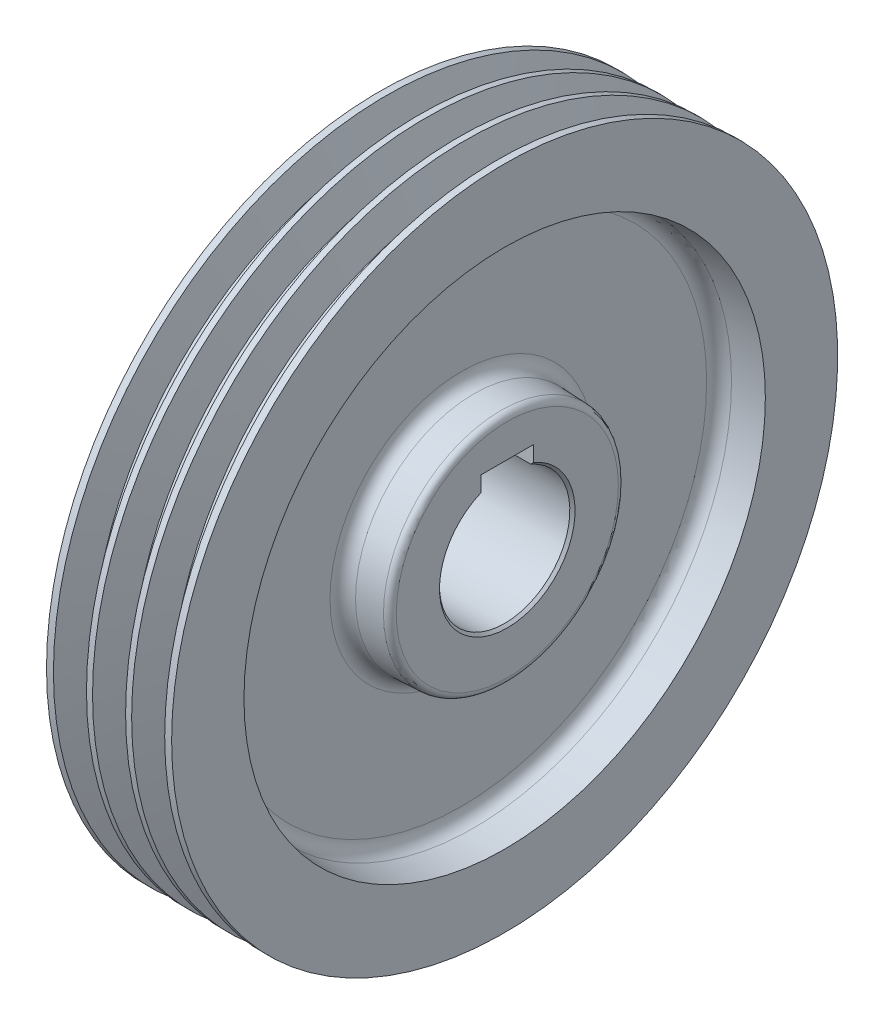
ISO-10303-21;
HEADER;
FILE_DESCRIPTION(('STEP AP214'),'2;1');
FILE_NAME('part.step','',(''),(''),'','','');
FILE_SCHEMA(('AUTOMOTIVE_DESIGN { 1 0 10303 214 1 1 1 1 }'));
ENDSEC;
DATA;
#1=APPLICATION_CONTEXT('core data for automotive mechanical design processes');
#2=APPLICATION_PROTOCOL_DEFINITION('international standard','automotive_design',2000,#1);
#3=PRODUCT_CONTEXT('',#1,'mechanical');
#4=PRODUCT('Part','Part','',(#3));
#5=PRODUCT_RELATED_PRODUCT_CATEGORY('part','',(#4));
#6=PRODUCT_DEFINITION_FORMATION('','',#4);
#7=PRODUCT_DEFINITION_CONTEXT('part definition',#1,'design');
#8=PRODUCT_DEFINITION('design','',#6,#7);
#9=PRODUCT_DEFINITION_SHAPE('','',#8);
#10=(LENGTH_UNIT() NAMED_UNIT(*) SI_UNIT(.MILLI.,.METRE.));
#11=(NAMED_UNIT(*) PLANE_ANGLE_UNIT() SI_UNIT($,.RADIAN.));
#12=(NAMED_UNIT(*) SI_UNIT($,.STERADIAN.) SOLID_ANGLE_UNIT());
#13=UNCERTAINTY_MEASURE_WITH_UNIT(LENGTH_MEASURE(1.E-05),#10,'distance_accuracy_value','');
#14=(GEOMETRIC_REPRESENTATION_CONTEXT(3) GLOBAL_UNCERTAINTY_ASSIGNED_CONTEXT((#13)) GLOBAL_UNIT_ASSIGNED_CONTEXT((#10,
#11,#12)) REPRESENTATION_CONTEXT('',''));
#15=CARTESIAN_POINT('',(0.,0.,0.));
#16=DIRECTION('',(0.,0.,1.));
#17=DIRECTION('',(1.,0.,0.));
#18=AXIS2_PLACEMENT_3D('',#15,#16,#17);
#19=CARTESIAN_POINT('',(0.,0.,0.));
#20=DIRECTION('',(-1.,0.,0.));
#21=DIRECTION('',(0.,0.,1.));
#22=AXIS2_PLACEMENT_3D('',#19,#20,#21);
#23=CYLINDRICAL_SURFACE('',#22,127.75);
#24=CARTESIAN_POINT('',(48.,0.,0.));
#25=DIRECTION('',(-1.,0.,0.));
#26=DIRECTION('',(0.,0.,1.));
#27=AXIS2_PLACEMENT_3D('',#24,#25,#26);
#28=CIRCLE('',#27,127.75);
#29=CARTESIAN_POINT('',(48.,0.,127.75));
#30=VERTEX_POINT('',#29);
#31=EDGE_CURVE('E234',#30,#30,#28,.T.);
#32=ORIENTED_EDGE('',*,*,#31,.T.);
#33=EDGE_LOOP('',(#32));
#34=FACE_BOUND('',#33,.T.);
#35=CARTESIAN_POINT('',(45.3407593740113,0.,0.));
#36=DIRECTION('',(-1.,0.,0.));
#37=DIRECTION('',(0.,0.,1.));
#38=AXIS2_PLACEMENT_3D('',#35,#36,#37);
#39=CIRCLE('',#38,127.75);
#40=CARTESIAN_POINT('',(45.3407593740113,0.,127.75));
#41=VERTEX_POINT('',#40);
#42=EDGE_CURVE('E258',#41,#41,#39,.T.);
#43=ORIENTED_EDGE('',*,*,#42,.F.);
#44=EDGE_LOOP('',(#43));
#45=FACE_BOUND('',#44,.T.);
#46=ADVANCED_FACE('F33',(#34,#45),#23,.T.);
#47=CARTESIAN_POINT('',(30.3407593740113,0.,0.));
#48=DIRECTION('',(-1.,0.,0.));
#49=DIRECTION('',(0.,0.,1.));
#50=AXIS2_PLACEMENT_3D('',#47,#48,#49);
#51=CIRCLE('',#50,127.75);
#52=CARTESIAN_POINT('',(30.3407593740113,0.,127.75));
#53=VERTEX_POINT('',#52);
#54=EDGE_CURVE('E272',#53,#53,#51,.T.);
#55=ORIENTED_EDGE('',*,*,#54,.F.);
#56=EDGE_LOOP('',(#55));
#57=FACE_BOUND('',#56,.T.);
#58=CARTESIAN_POINT('',(32.6592406259887,0.,0.));
#59=DIRECTION('',(-1.,0.,0.));
#60=DIRECTION('',(0.,0.,1.));
#61=AXIS2_PLACEMENT_3D('',#58,#59,#60);
#62=CIRCLE('',#61,127.75);
#63=CARTESIAN_POINT('',(32.6592406259887,0.,127.75));
#64=VERTEX_POINT('',#63);
#65=EDGE_CURVE('E254',#64,#64,#62,.T.);
#66=ORIENTED_EDGE('',*,*,#65,.T.);
#67=EDGE_LOOP('',(#66));
#68=FACE_BOUND('',#67,.T.);
#69=ADVANCED_FACE('F187',(#57,#68),#23,.T.);
#70=CARTESIAN_POINT('',(15.3407593740113,0.,0.));
#71=DIRECTION('',(-1.,0.,0.));
#72=DIRECTION('',(0.,0.,1.));
#73=AXIS2_PLACEMENT_3D('',#70,#71,#72);
#74=CIRCLE('',#73,127.75);
#75=CARTESIAN_POINT('',(15.3407593740113,0.,127.75));
#76=VERTEX_POINT('',#75);
#77=EDGE_CURVE('E218',#76,#76,#74,.T.);
#78=ORIENTED_EDGE('',*,*,#77,.F.);
#79=EDGE_LOOP('',(#78));
#80=FACE_BOUND('',#79,.T.);
#81=CARTESIAN_POINT('',(17.6592406259887,0.,0.));
#82=DIRECTION('',(-1.,0.,0.));
#83=DIRECTION('',(0.,0.,1.));
#84=AXIS2_PLACEMENT_3D('',#81,#82,#83);
#85=CIRCLE('',#84,127.75);
#86=CARTESIAN_POINT('',(17.6592406259887,0.,127.75));
#87=VERTEX_POINT('',#86);
#88=EDGE_CURVE('E269',#87,#87,#85,.T.);
#89=ORIENTED_EDGE('',*,*,#88,.T.);
#90=EDGE_LOOP('',(#89));
#91=FACE_BOUND('',#90,.T.);
#92=ADVANCED_FACE('F194',(#80,#91),#23,.T.);
#93=CARTESIAN_POINT('',(0.,0.,0.));
#94=DIRECTION('',(-1.,0.,0.));
#95=DIRECTION('',(0.,0.,1.));
#96=AXIS2_PLACEMENT_3D('',#93,#94,#95);
#97=CIRCLE('',#96,127.75);
#98=CARTESIAN_POINT('',(0.,0.,127.75));
#99=VERTEX_POINT('',#98);
#100=EDGE_CURVE('E213',#99,#99,#97,.T.);
#101=ORIENTED_EDGE('',*,*,#100,.F.);
#102=EDGE_LOOP('',(#101));
#103=FACE_BOUND('',#102,.T.);
#104=CARTESIAN_POINT('',(2.65924062598869,0.,0.));
#105=DIRECTION('',(-1.,0.,0.));
#106=DIRECTION('',(0.,0.,1.));
#107=AXIS2_PLACEMENT_3D('',#104,#105,#106);
#108=CIRCLE('',#107,127.75);
#109=CARTESIAN_POINT('',(2.65924062598869,0.,127.75));
#110=VERTEX_POINT('',#109);
#111=EDGE_CURVE('E216',#110,#110,#108,.T.);
#112=ORIENTED_EDGE('',*,*,#111,.T.);
#113=EDGE_LOOP('',(#112));
#114=FACE_BOUND('',#113,.T.);
#115=ADVANCED_FACE('F190',(#103,#114),#23,.T.);
#116=CARTESIAN_POINT('',(0.,0.,0.));
#117=DIRECTION('',(-1.,0.,0.));
#118=DIRECTION('',(0.,0.,1.));
#119=AXIS2_PLACEMENT_3D('',#116,#117,#118);
#120=CYLINDRICAL_SURFACE('',#119,25.);
#121=CARTESIAN_POINT('',(0.,0.,0.));
#122=DIRECTION('',(1.,0.,0.));
#123=DIRECTION('',(0.,0.,-1.));
#124=AXIS2_PLACEMENT_3D('',#121,#122,#123);
#125=CIRCLE('',#124,25.);
#126=CARTESIAN_POINT('',(0.,22.9128784747792,-10.));
#127=VERTEX_POINT('',#126);
#128=CARTESIAN_POINT('',(0.,22.9128784747792,10.));
#129=VERTEX_POINT('',#128);
#130=EDGE_CURVE('E243',#127,#129,#125,.F.);
#131=ORIENTED_EDGE('',*,*,#130,.T.);
#132=DIRECTION('',(-1.,0.,0.));
#133=VECTOR('',#132,1.);
#134=CARTESIAN_POINT('',(49.,22.9128784747792,10.));
#135=LINE('',#134,#133);
#136=CARTESIAN_POINT('',(48.,22.9128784747792,10.));
#137=VERTEX_POINT('',#136);
#138=EDGE_CURVE('E93',#137,#129,#135,.T.);
#139=ORIENTED_EDGE('',*,*,#138,.F.);
#140=CARTESIAN_POINT('',(48.,0.,0.));
#141=DIRECTION('',(-1.,0.,0.));
#142=DIRECTION('',(0.,0.,1.));
#143=AXIS2_PLACEMENT_3D('',#140,#141,#142);
#144=CIRCLE('',#143,25.);
#145=CARTESIAN_POINT('',(48.,22.9128784747792,-10.));
#146=VERTEX_POINT('',#145);
#147=EDGE_CURVE('E240',#137,#146,#144,.F.);
#148=ORIENTED_EDGE('',*,*,#147,.T.);
#149=DIRECTION('',(-1.,0.,0.));
#150=VECTOR('',#149,1.);
#151=CARTESIAN_POINT('',(49.,22.9128784747792,-10.));
#152=LINE('',#151,#150);
#153=EDGE_CURVE('E101',#146,#127,#152,.T.);
#154=ORIENTED_EDGE('',*,*,#153,.T.);
#155=EDGE_LOOP('',(#131,#139,#148,#154));
#156=FACE_BOUND('',#155,.T.);
#157=ADVANCED_FACE('F201',(#156),#120,.F.);
#158=CARTESIAN_POINT('',(-1.,25.,0.));
#159=DIRECTION('',(1.,0.,0.));
#160=DIRECTION('',(0.,0.,-1.));
#161=AXIS2_PLACEMENT_3D('',#158,#159,#160);
#162=PLANE('',#161);
#163=CARTESIAN_POINT('',(-1.,0.,0.));
#164=DIRECTION('',(1.,0.,0.));
#165=DIRECTION('',(0.,0.,-1.));
#166=AXIS2_PLACEMENT_3D('',#163,#164,#165);
#167=CIRCLE('',#166,42.7091720649564);
#168=CARTESIAN_POINT('',(-1.,0.,-42.7091720649564));
#169=VERTEX_POINT('',#168);
#170=EDGE_CURVE('E41',#169,#169,#167,.F.);
#171=ORIENTED_EDGE('',*,*,#170,.T.);
#172=EDGE_LOOP('',(#171));
#173=FACE_BOUND('',#172,.T.);
#174=CARTESIAN_POINT('',(-1.,0.,0.));
#175=DIRECTION('',(1.,0.,0.));
#176=DIRECTION('',(0.,0.,-1.));
#177=AXIS2_PLACEMENT_3D('',#174,#175,#176);
#178=CIRCLE('',#177,26.);
#179=CARTESIAN_POINT('',(-1.,24.,10.));
#180=VERTEX_POINT('',#179);
#181=CARTESIAN_POINT('',(-1.,24.,-10.));
#182=VERTEX_POINT('',#181);
#183=EDGE_CURVE('E245',#180,#182,#178,.T.);
#184=ORIENTED_EDGE('',*,*,#183,.T.);
#185=DIRECTION('',(0.,-1.,0.));
#186=VECTOR('',#185,1.);
#187=CARTESIAN_POINT('',(-1.,22.9128784747792,-10.));
#188=LINE('',#187,#186);
#189=CARTESIAN_POINT('',(-1.,29.9,-10.));
#190=VERTEX_POINT('',#189);
#191=EDGE_CURVE('E56',#190,#182,#188,.T.);
#192=ORIENTED_EDGE('',*,*,#191,.F.);
#193=DIRECTION('',(0.,0.,-1.));
#194=VECTOR('',#193,1.);
#195=CARTESIAN_POINT('',(-1.,29.9,-10.));
#196=LINE('',#195,#194);
#197=CARTESIAN_POINT('',(-1.,29.9,10.));
#198=VERTEX_POINT('',#197);
#199=EDGE_CURVE('E109',#198,#190,#196,.T.);
#200=ORIENTED_EDGE('',*,*,#199,.F.);
#201=DIRECTION('',(0.,1.,0.));
#202=VECTOR('',#201,1.);
#203=CARTESIAN_POINT('',(-1.,22.9128784747792,10.));
#204=LINE('',#203,#202);
#205=EDGE_CURVE('E88',#180,#198,#204,.T.);
#206=ORIENTED_EDGE('',*,*,#205,.F.);
#207=EDGE_LOOP('',(#184,#192,#200,#206));
#208=FACE_BOUND('',#207,.T.);
#209=ADVANCED_FACE('F207',(#173,#208),#162,.F.);
#210=CARTESIAN_POINT('',(16.5,0.,0.));
#211=DIRECTION('',(1.,0.,0.));
#212=DIRECTION('',(0.,0.,-1.));
#213=AXIS2_PLACEMENT_3D('',#210,#211,#212);
#214=CONICAL_SURFACE('',#213,46.5310516117034,0.0872664625997025);
#215=CARTESIAN_POINT('',(1.282110643131,0.,0.));
#216=DIRECTION('',(-1.,0.,0.));
#217=DIRECTION('',(0.,0.,1.));
#218=AXIS2_PLACEMENT_3D('',#215,#216,#217);
#219=CIRCLE('',#218,45.1996588101858);
#220=CARTESIAN_POINT('',(1.282110643131,0.,45.1996588101858));
#221=VERTEX_POINT('',#220);
#222=EDGE_CURVE('E11',#221,#221,#219,.F.);
#223=ORIENTED_EDGE('',*,*,#222,.T.);
#224=EDGE_LOOP('',(#223));
#225=FACE_BOUND('',#224,.T.);
#226=CARTESIAN_POINT('',(11.9357787137382,0.,0.));
#227=DIRECTION('',(1.,0.,0.));
#228=DIRECTION('',(0.,0.,-1.));
#229=AXIS2_PLACEMENT_3D('',#226,#227,#228);
#230=CIRCLE('',#229,46.1317339913319);
#231=CARTESIAN_POINT('',(11.9357787137382,0.,-46.1317339913319));
#232=VERTEX_POINT('',#231);
#233=EDGE_CURVE('E384',#232,#232,#230,.F.);
#234=ORIENTED_EDGE('',*,*,#233,.T.);
#235=EDGE_LOOP('',(#234));
#236=FACE_BOUND('',#235,.T.);
#237=ADVANCED_FACE('F345',(#225,#236),#214,.T.);
#238=CARTESIAN_POINT('',(16.5,46.5310516117034,0.));
#239=DIRECTION('',(1.,0.,0.));
#240=DIRECTION('',(0.,0.,-1.));
#241=AXIS2_PLACEMENT_3D('',#238,#239,#240);
#242=PLANE('',#241);
#243=CARTESIAN_POINT('',(16.5,0.,0.));
#244=DIRECTION('',(1.,0.,0.));
#245=DIRECTION('',(0.,0.,-1.));
#246=AXIS2_PLACEMENT_3D('',#243,#244,#245);
#247=CIRCLE('',#246,51.1127074817906);
#248=CARTESIAN_POINT('',(16.5,0.,-51.1127074817906));
#249=VERTEX_POINT('',#248);
#250=EDGE_CURVE('E379',#249,#249,#247,.T.);
#251=ORIENTED_EDGE('',*,*,#250,.T.);
#252=EDGE_LOOP('',(#251));
#253=FACE_BOUND('',#252,.T.);
#254=CARTESIAN_POINT('',(16.5,0.,0.));
#255=DIRECTION('',(1.,0.,0.));
#256=DIRECTION('',(0.,0.,-1.));
#257=AXIS2_PLACEMENT_3D('',#254,#255,#256);
#258=CIRCLE('',#257,94.5361263688525);
#259=CARTESIAN_POINT('',(16.5,0.,-94.5361263688525));
#260=VERTEX_POINT('',#259);
#261=EDGE_CURVE('E382',#260,#260,#258,.F.);
#262=ORIENTED_EDGE('',*,*,#261,.T.);
#263=EDGE_LOOP('',(#262));
#264=FACE_BOUND('',#263,.T.);
#265=ADVANCED_FACE('F337',(#253,#264),#242,.F.);
#266=CARTESIAN_POINT('',(0.,0.,0.));
#267=DIRECTION('',(-1.,0.,0.));
#268=DIRECTION('',(0.,0.,1.));
#269=AXIS2_PLACEMENT_3D('',#266,#267,#268);
#270=CONICAL_SURFACE('',#269,100.,0.0399680398706699);
#271=CARTESIAN_POINT('',(11.6997869980079,0.,0.));
#272=DIRECTION('',(-1.,0.,0.));
#273=DIRECTION('',(0.,0.,1.));
#274=AXIS2_PLACEMENT_3D('',#271,#272,#273);
#275=CIRCLE('',#274,99.5321332899273);
#276=CARTESIAN_POINT('',(11.6997869980079,0.,99.5321332899273));
#277=VERTEX_POINT('',#276);
#278=EDGE_CURVE('E376',#277,#277,#275,.F.);
#279=ORIENTED_EDGE('',*,*,#278,.T.);
#280=EDGE_LOOP('',(#279));
#281=FACE_BOUND('',#280,.T.);
#282=CARTESIAN_POINT('',(0.,0.,0.));
#283=DIRECTION('',(-1.,0.,0.));
#284=DIRECTION('',(0.,0.,1.));
#285=AXIS2_PLACEMENT_3D('',#282,#283,#284);
#286=CIRCLE('',#285,100.);
#287=CARTESIAN_POINT('',(0.,0.,100.));
#288=VERTEX_POINT('',#287);
#289=EDGE_CURVE('E237',#288,#288,#286,.T.);
#290=ORIENTED_EDGE('',*,*,#289,.T.);
#291=EDGE_LOOP('',(#290));
#292=FACE_BOUND('',#291,.T.);
#293=ADVANCED_FACE('F328',(#281,#292),#270,.F.);
#294=CARTESIAN_POINT('',(0.,100.,0.));
#295=DIRECTION('',(1.,0.,0.));
#296=DIRECTION('',(0.,0.,-1.));
#297=AXIS2_PLACEMENT_3D('',#294,#295,#296);
#298=PLANE('',#297);
#299=ORIENTED_EDGE('',*,*,#289,.F.);
#300=EDGE_LOOP('',(#299));
#301=FACE_BOUND('',#300,.T.);
#302=ORIENTED_EDGE('',*,*,#100,.T.);
#303=EDGE_LOOP('',(#302));
#304=FACE_BOUND('',#303,.T.);
#305=ADVANCED_FACE('F323',(#301,#304),#298,.F.);
#306=CARTESIAN_POINT('',(48.,127.75,0.));
#307=DIRECTION('',(-1.,0.,0.));
#308=DIRECTION('',(0.,0.,1.));
#309=AXIS2_PLACEMENT_3D('',#306,#307,#308);
#310=PLANE('',#309);
#311=ORIENTED_EDGE('',*,*,#31,.F.);
#312=EDGE_LOOP('',(#311));
#313=FACE_BOUND('',#312,.T.);
#314=CARTESIAN_POINT('',(48.,0.,0.));
#315=DIRECTION('',(-1.,0.,0.));
#316=DIRECTION('',(0.,0.,1.));
#317=AXIS2_PLACEMENT_3D('',#314,#315,#316);
#318=CIRCLE('',#317,100.);
#319=CARTESIAN_POINT('',(48.,0.,100.));
#320=VERTEX_POINT('',#319);
#321=EDGE_CURVE('E231',#320,#320,#318,.T.);
#322=ORIENTED_EDGE('',*,*,#321,.T.);
#323=EDGE_LOOP('',(#322));
#324=FACE_BOUND('',#323,.T.);
#325=ADVANCED_FACE('F320',(#313,#324),#310,.F.);
#326=CARTESIAN_POINT('',(31.5,0.,0.));
#327=DIRECTION('',(1.,0.,0.));
#328=DIRECTION('',(0.,0.,-1.));
#329=AXIS2_PLACEMENT_3D('',#326,#327,#328);
#330=CONICAL_SURFACE('',#329,98.5564370518225,0.0872664625997028);
#331=CARTESIAN_POINT('',(36.0642212862618,0.,0.));
#332=DIRECTION('',(1.,0.,0.));
#333=DIRECTION('',(0.,0.,-1.));
#334=AXIS2_PLACEMENT_3D('',#331,#332,#333);
#335=CIRCLE('',#334,98.9557546721941);
#336=CARTESIAN_POINT('',(36.0642212862618,0.,-98.9557546721941));
#337=VERTEX_POINT('',#336);
#338=EDGE_CURVE('E364',#337,#337,#335,.F.);
#339=ORIENTED_EDGE('',*,*,#338,.T.);
#340=EDGE_LOOP('',(#339));
#341=FACE_BOUND('',#340,.T.);
#342=ORIENTED_EDGE('',*,*,#321,.F.);
#343=EDGE_LOOP('',(#342));
#344=FACE_BOUND('',#343,.T.);
#345=ADVANCED_FACE('F317',(#341,#344),#330,.F.);
#346=CARTESIAN_POINT('',(31.5,98.5564370518225,0.));
#347=DIRECTION('',(-1.,0.,0.));
#348=DIRECTION('',(0.,0.,1.));
#349=AXIS2_PLACEMENT_3D('',#346,#347,#348);
#350=PLANE('',#349);
#351=CARTESIAN_POINT('',(31.5,0.,0.));
#352=DIRECTION('',(-1.,0.,0.));
#353=DIRECTION('',(0.,0.,1.));
#354=AXIS2_PLACEMENT_3D('',#351,#352,#353);
#355=CIRCLE('',#354,50.5038629668638);
#356=CARTESIAN_POINT('',(31.5,0.,50.5038629668638));
#357=VERTEX_POINT('',#356);
#358=EDGE_CURVE('E370',#357,#357,#355,.T.);
#359=ORIENTED_EDGE('',*,*,#358,.T.);
#360=EDGE_LOOP('',(#359));
#361=FACE_BOUND('',#360,.T.);
#362=CARTESIAN_POINT('',(31.5,0.,0.));
#363=DIRECTION('',(-1.,0.,0.));
#364=DIRECTION('',(0.,0.,1.));
#365=AXIS2_PLACEMENT_3D('',#362,#363,#364);
#366=CIRCLE('',#365,93.9747811817353);
#367=CARTESIAN_POINT('',(31.5,0.,93.9747811817353));
#368=VERTEX_POINT('',#367);
#369=EDGE_CURVE('E373',#368,#368,#366,.F.);
#370=ORIENTED_EDGE('',*,*,#369,.T.);
#371=EDGE_LOOP('',(#370));
#372=FACE_BOUND('',#371,.T.);
#373=ADVANCED_FACE('F313',(#361,#372),#350,.F.);
#374=CARTESIAN_POINT('',(49.,0.,0.));
#375=DIRECTION('',(-1.,0.,0.));
#376=DIRECTION('',(0.,0.,1.));
#377=AXIS2_PLACEMENT_3D('',#374,#375,#376);
#378=CONICAL_SURFACE('',#377,45.,0.0399680398706701);
#379=CARTESIAN_POINT('',(46.599893499004,0.,0.));
#380=DIRECTION('',(1.,0.,0.));
#381=DIRECTION('',(0.,0.,-1.));
#382=AXIS2_PLACEMENT_3D('',#379,#380,#381);
#383=CIRCLE('',#382,45.0959786646232);
#384=CARTESIAN_POINT('',(46.599893499004,0.,-45.0959786646232));
#385=VERTEX_POINT('',#384);
#386=EDGE_CURVE('E359',#385,#385,#383,.F.);
#387=ORIENTED_EDGE('',*,*,#386,.T.);
#388=EDGE_LOOP('',(#387));
#389=FACE_BOUND('',#388,.T.);
#390=CARTESIAN_POINT('',(36.3002130019921,0.,0.));
#391=DIRECTION('',(-1.,0.,0.));
#392=DIRECTION('',(0.,0.,1.));
#393=AXIS2_PLACEMENT_3D('',#390,#391,#392);
#394=CIRCLE('',#393,45.5078560457891);
#395=CARTESIAN_POINT('',(36.3002130019921,0.,45.5078560457891));
#396=VERTEX_POINT('',#395);
#397=EDGE_CURVE('E367',#396,#396,#394,.F.);
#398=ORIENTED_EDGE('',*,*,#397,.T.);
#399=EDGE_LOOP('',(#398));
#400=FACE_BOUND('',#399,.T.);
#401=ADVANCED_FACE('F309',(#389,#400),#378,.T.);
#402=CARTESIAN_POINT('',(49.,45.,0.));
#403=DIRECTION('',(-1.,0.,0.));
#404=DIRECTION('',(0.,0.,1.));
#405=AXIS2_PLACEMENT_3D('',#402,#403,#404);
#406=PLANE('',#405);
#407=CARTESIAN_POINT('',(49.,0.,0.));
#408=DIRECTION('',(-1.,0.,0.));
#409=DIRECTION('',(0.,0.,1.));
#410=AXIS2_PLACEMENT_3D('',#407,#408,#409);
#411=CIRCLE('',#410,42.5979752040859);
#412=CARTESIAN_POINT('',(49.,0.,42.5979752040859));
#413=VERTEX_POINT('',#412);
#414=EDGE_CURVE('E357',#413,#413,#411,.F.);
#415=ORIENTED_EDGE('',*,*,#414,.T.);
#416=EDGE_LOOP('',(#415));
#417=FACE_BOUND('',#416,.T.);
#418=DIRECTION('',(0.,0.,-1.));
#419=VECTOR('',#418,1.);
#420=CARTESIAN_POINT('',(49.,29.9,-10.));
#421=LINE('',#420,#419);
#422=CARTESIAN_POINT('',(49.,29.9,10.));
#423=VERTEX_POINT('',#422);
#424=CARTESIAN_POINT('',(49.,29.9,-10.));
#425=VERTEX_POINT('',#424);
#426=EDGE_CURVE('E96',#423,#425,#421,.T.);
#427=ORIENTED_EDGE('',*,*,#426,.T.);
#428=DIRECTION('',(0.,-1.,0.));
#429=VECTOR('',#428,1.);
#430=CARTESIAN_POINT('',(49.,22.9128784747792,-10.));
#431=LINE('',#430,#429);
#432=CARTESIAN_POINT('',(49.,23.9999999999999,-10.));
#433=VERTEX_POINT('',#432);
#434=EDGE_CURVE('E107',#425,#433,#431,.T.);
#435=ORIENTED_EDGE('',*,*,#434,.T.);
#436=CARTESIAN_POINT('',(49.,0.,0.));
#437=DIRECTION('',(-1.,0.,0.));
#438=DIRECTION('',(0.,0.,1.));
#439=AXIS2_PLACEMENT_3D('',#436,#437,#438);
#440=CIRCLE('',#439,25.9999999999999);
#441=CARTESIAN_POINT('',(49.,23.9999999999999,10.));
#442=VERTEX_POINT('',#441);
#443=EDGE_CURVE('E106',#433,#442,#440,.T.);
#444=ORIENTED_EDGE('',*,*,#443,.T.);
#445=DIRECTION('',(0.,1.,0.));
#446=VECTOR('',#445,1.);
#447=CARTESIAN_POINT('',(49.,22.9128784747792,10.));
#448=LINE('',#447,#446);
#449=EDGE_CURVE('E48',#442,#423,#448,.T.);
#450=ORIENTED_EDGE('',*,*,#449,.T.);
#451=EDGE_LOOP('',(#427,#435,#444,#450));
#452=FACE_BOUND('',#451,.T.);
#453=ADVANCED_FACE('F104',(#417,#452),#406,.F.);
#454=CARTESIAN_POINT('',(0.,0.,0.));
#455=DIRECTION('',(-1.,0.,0.));
#456=DIRECTION('',(0.,0.,1.));
#457=AXIS2_PLACEMENT_3D('',#454,#455,#456);
#458=CYLINDRICAL_SURFACE('',#457,116.3);
#459=CARTESIAN_POINT('',(11.8401430713097,0.,0.));
#460=DIRECTION('',(-1.,0.,0.));
#461=DIRECTION('',(0.,0.,1.));
#462=AXIS2_PLACEMENT_3D('',#459,#460,#461);
#463=CIRCLE('',#462,116.3);
#464=CARTESIAN_POINT('',(11.8401430713097,0.,116.3));
#465=VERTEX_POINT('',#464);
#466=EDGE_CURVE('E222',#465,#465,#463,.T.);
#467=ORIENTED_EDGE('',*,*,#466,.T.);
#468=EDGE_LOOP('',(#467));
#469=FACE_BOUND('',#468,.T.);
#470=CARTESIAN_POINT('',(6.15985692869032,0.,0.));
#471=DIRECTION('',(-1.,0.,0.));
#472=DIRECTION('',(0.,0.,1.));
#473=AXIS2_PLACEMENT_3D('',#470,#471,#472);
#474=CIRCLE('',#473,116.3);
#475=CARTESIAN_POINT('',(6.15985692869032,0.,116.3));
#476=VERTEX_POINT('',#475);
#477=EDGE_CURVE('E219',#476,#476,#474,.T.);
#478=ORIENTED_EDGE('',*,*,#477,.F.);
#479=EDGE_LOOP('',(#478));
#480=FACE_BOUND('',#479,.T.);
#481=ADVANCED_FACE('F302',(#469,#480),#458,.T.);
#482=CARTESIAN_POINT('',(11.8401430713097,0.,0.));
#483=DIRECTION('',(1.,0.,0.));
#484=DIRECTION('',(0.,0.,-1.));
#485=AXIS2_PLACEMENT_3D('',#482,#483,#484);
#486=CONICAL_SURFACE('',#485,116.3,1.27409035395586);
#487=ORIENTED_EDGE('',*,*,#77,.T.);
#488=EDGE_LOOP('',(#487));
#489=FACE_BOUND('',#488,.T.);
#490=ORIENTED_EDGE('',*,*,#466,.F.);
#491=EDGE_LOOP('',(#490));
#492=FACE_BOUND('',#491,.T.);
#493=ADVANCED_FACE('F298',(#489,#492),#486,.T.);
#494=CARTESIAN_POINT('',(2.65924062598869,0.,0.));
#495=DIRECTION('',(-1.,0.,0.));
#496=DIRECTION('',(0.,0.,1.));
#497=AXIS2_PLACEMENT_3D('',#494,#495,#496);
#498=CONICAL_SURFACE('',#497,127.75,1.27409035395586);
#499=ORIENTED_EDGE('',*,*,#477,.T.);
#500=EDGE_LOOP('',(#499));
#501=FACE_BOUND('',#500,.T.);
#502=ORIENTED_EDGE('',*,*,#111,.F.);
#503=EDGE_LOOP('',(#502));
#504=FACE_BOUND('',#503,.T.);
#505=ADVANCED_FACE('F292',(#501,#504),#498,.T.);
#506=CARTESIAN_POINT('',(15.,0.,0.));
#507=DIRECTION('',(-1.,0.,0.));
#508=DIRECTION('',(0.,0.,1.));
#509=AXIS2_PLACEMENT_3D('',#506,#507,#508);
#510=CYLINDRICAL_SURFACE('',#509,116.3);
#511=CARTESIAN_POINT('',(26.8401430713097,0.,0.));
#512=DIRECTION('',(-1.,0.,0.));
#513=DIRECTION('',(0.,0.,1.));
#514=AXIS2_PLACEMENT_3D('',#511,#512,#513);
#515=CIRCLE('',#514,116.3);
#516=CARTESIAN_POINT('',(26.8401430713097,0.,116.3));
#517=VERTEX_POINT('',#516);
#518=EDGE_CURVE('E225',#517,#517,#515,.T.);
#519=ORIENTED_EDGE('',*,*,#518,.T.);
#520=EDGE_LOOP('',(#519));
#521=FACE_BOUND('',#520,.T.);
#522=CARTESIAN_POINT('',(21.1598569286903,0.,0.));
#523=DIRECTION('',(-1.,0.,0.));
#524=DIRECTION('',(0.,0.,1.));
#525=AXIS2_PLACEMENT_3D('',#522,#523,#524);
#526=CIRCLE('',#525,116.3);
#527=CARTESIAN_POINT('',(21.1598569286903,0.,116.3));
#528=VERTEX_POINT('',#527);
#529=EDGE_CURVE('E266',#528,#528,#526,.T.);
#530=ORIENTED_EDGE('',*,*,#529,.F.);
#531=EDGE_LOOP('',(#530));
#532=FACE_BOUND('',#531,.T.);
#533=ADVANCED_FACE('F277',(#521,#532),#510,.T.);
#534=CARTESIAN_POINT('',(26.8401430713097,0.,0.));
#535=DIRECTION('',(1.,0.,0.));
#536=DIRECTION('',(0.,0.,-1.));
#537=AXIS2_PLACEMENT_3D('',#534,#535,#536);
#538=CONICAL_SURFACE('',#537,116.3,1.27409035395586);
#539=ORIENTED_EDGE('',*,*,#54,.T.);
#540=EDGE_LOOP('',(#539));
#541=FACE_BOUND('',#540,.T.);
#542=ORIENTED_EDGE('',*,*,#518,.F.);
#543=EDGE_LOOP('',(#542));
#544=FACE_BOUND('',#543,.T.);
#545=ADVANCED_FACE('F280',(#541,#544),#538,.T.);
#546=CARTESIAN_POINT('',(17.6592406259887,0.,0.));
#547=DIRECTION('',(-1.,0.,0.));
#548=DIRECTION('',(0.,0.,1.));
#549=AXIS2_PLACEMENT_3D('',#546,#547,#548);
#550=CONICAL_SURFACE('',#549,127.75,1.27409035395586);
#551=ORIENTED_EDGE('',*,*,#529,.T.);
#552=EDGE_LOOP('',(#551));
#553=FACE_BOUND('',#552,.T.);
#554=ORIENTED_EDGE('',*,*,#88,.F.);
#555=EDGE_LOOP('',(#554));
#556=FACE_BOUND('',#555,.T.);
#557=ADVANCED_FACE('F282',(#553,#556),#550,.T.);
#558=CARTESIAN_POINT('',(30.,0.,0.));
#559=DIRECTION('',(-1.,0.,0.));
#560=DIRECTION('',(0.,0.,1.));
#561=AXIS2_PLACEMENT_3D('',#558,#559,#560);
#562=CYLINDRICAL_SURFACE('',#561,116.3);
#563=CARTESIAN_POINT('',(41.8401430713097,0.,0.));
#564=DIRECTION('',(-1.,0.,0.));
#565=DIRECTION('',(0.,0.,1.));
#566=AXIS2_PLACEMENT_3D('',#563,#564,#565);
#567=CIRCLE('',#566,116.3);
#568=CARTESIAN_POINT('',(41.8401430713097,0.,116.3));
#569=VERTEX_POINT('',#568);
#570=EDGE_CURVE('E263',#569,#569,#567,.T.);
#571=ORIENTED_EDGE('',*,*,#570,.T.);
#572=EDGE_LOOP('',(#571));
#573=FACE_BOUND('',#572,.T.);
#574=CARTESIAN_POINT('',(36.1598569286903,0.,0.));
#575=DIRECTION('',(-1.,0.,0.));
#576=DIRECTION('',(0.,0.,1.));
#577=AXIS2_PLACEMENT_3D('',#574,#575,#576);
#578=CIRCLE('',#577,116.3);
#579=CARTESIAN_POINT('',(36.1598569286903,0.,116.3));
#580=VERTEX_POINT('',#579);
#581=EDGE_CURVE('E252',#580,#580,#578,.T.);
#582=ORIENTED_EDGE('',*,*,#581,.F.);
#583=EDGE_LOOP('',(#582));
#584=FACE_BOUND('',#583,.T.);
#585=ADVANCED_FACE('F289',(#573,#584),#562,.T.);
#586=CARTESIAN_POINT('',(41.8401430713097,0.,0.));
#587=DIRECTION('',(1.,0.,0.));
#588=DIRECTION('',(0.,0.,-1.));
#589=AXIS2_PLACEMENT_3D('',#586,#587,#588);
#590=CONICAL_SURFACE('',#589,116.3,1.27409035395586);
#591=ORIENTED_EDGE('',*,*,#42,.T.);
#592=EDGE_LOOP('',(#591));
#593=FACE_BOUND('',#592,.T.);
#594=ORIENTED_EDGE('',*,*,#570,.F.);
#595=EDGE_LOOP('',(#594));
#596=FACE_BOUND('',#595,.T.);
#597=ADVANCED_FACE('F481',(#593,#596),#590,.T.);
#598=CARTESIAN_POINT('',(32.6592406259887,0.,0.));
#599=DIRECTION('',(-1.,0.,0.));
#600=DIRECTION('',(0.,0.,1.));
#601=AXIS2_PLACEMENT_3D('',#598,#599,#600);
#602=CONICAL_SURFACE('',#601,127.75,1.27409035395586);
#603=ORIENTED_EDGE('',*,*,#581,.T.);
#604=EDGE_LOOP('',(#603));
#605=FACE_BOUND('',#604,.T.);
#606=ORIENTED_EDGE('',*,*,#65,.F.);
#607=EDGE_LOOP('',(#606));
#608=FACE_BOUND('',#607,.T.);
#609=ADVANCED_FACE('F506',(#605,#608),#602,.T.);
#610=CARTESIAN_POINT('',(0.,0.,0.));
#611=DIRECTION('',(-1.,0.,0.));
#612=DIRECTION('',(0.,0.,1.));
#613=AXIS2_PLACEMENT_3D('',#610,#611,#612);
#614=CONICAL_SURFACE('',#613,25.,0.785398163397443);
#615=CARTESIAN_POINT('',(-4.72508401289114,27.9925100620404,-10.));
#616=CARTESIAN_POINT('',(-4.36428615410913,27.6093773862573,-10.));
#617=CARTESIAN_POINT('',(-4.00392869893594,27.2258304183999,-10.));
#618=CARTESIAN_POINT('',(-3.28421704281674,26.4577950415907,-10.));
#619=CARTESIAN_POINT('',(-2.92486284383299,26.0733066308002,-10.));
#620=CARTESIAN_POINT('',(-1.84853772028912,24.918312422088,-10.));
#621=CARTESIAN_POINT('',(-1.13325717053332,24.1462276969819,-10.));
#622=CARTESIAN_POINT('',(-0.0647538451639138,22.9840156125533,-10.));
#623=CARTESIAN_POINT('',(0.290683907954202,22.5959238730518,-10.));
#624=CARTESIAN_POINT('',(0.999845556466658,21.818178840576,-10.));
#625=CARTESIAN_POINT('',(1.35356945656006,21.4285255518884,-10.));
#626=CARTESIAN_POINT('',(2.05905479407671,20.6474008101355,-10.));
#627=CARTESIAN_POINT('',(2.41081610741735,20.2559292449156,-10.));
#628=CARTESIAN_POINT('',(3.11199783772515,19.4708888929116,-10.));
#629=CARTESIAN_POINT('',(3.46141823141774,19.0773200853455,-10.));
#630=CARTESIAN_POINT('',(3.80948660194246,18.6825549128929,-10.));
#631=B_SPLINE_CURVE_WITH_KNOTS('',3,(#615,#616,#617,#618,#619,#620,#621,#622,#623,#624,#625,
#626,#627,#628,#629,#630),.UNSPECIFIED.,.F.,.F.,(4,2,2,2,2,2,2,4),(0.,1.57882482091375,
3.15765272767388,6.31510258173963,7.89388318156083,9.47265945020889,11.0515344293257,
12.6304250831761),.UNSPECIFIED.);
#632=EDGE_CURVE('E126',#182,#127,#631,.T.);
#633=ORIENTED_EDGE('',*,*,#632,.F.);
#634=ORIENTED_EDGE('',*,*,#183,.F.);
#635=CARTESIAN_POINT('',(3.80948660194246,18.6825549128929,10.));
#636=CARTESIAN_POINT('',(3.46141823141774,19.0773200853455,10.));
#637=CARTESIAN_POINT('',(3.11199783772515,19.4708888929116,10.));
#638=CARTESIAN_POINT('',(2.41081610741735,20.2559292449156,10.));
#639=CARTESIAN_POINT('',(2.05905479407671,20.6474008101355,10.));
#640=CARTESIAN_POINT('',(1.35356945656006,21.4285255518884,10.));
#641=CARTESIAN_POINT('',(0.999845556466656,21.818178840576,10.));
#642=CARTESIAN_POINT('',(0.290683907954201,22.5959238730518,10.));
#643=CARTESIAN_POINT('',(-0.0647538451639146,22.9840156125533,10.));
#644=CARTESIAN_POINT('',(-1.13325717053332,24.1462276969819,10.));
#645=CARTESIAN_POINT('',(-1.84853772028912,24.9183124220879,10.));
#646=CARTESIAN_POINT('',(-2.92486284383299,26.0733066308002,10.));
#647=CARTESIAN_POINT('',(-3.28421704281674,26.4577950415907,10.));
#648=CARTESIAN_POINT('',(-4.00392869893594,27.2258304183999,10.));
#649=CARTESIAN_POINT('',(-4.36428615410913,27.6093773862573,10.));
#650=CARTESIAN_POINT('',(-4.72508401289114,27.9925100620404,10.));
#651=B_SPLINE_CURVE_WITH_KNOTS('',3,(#635,#636,#637,#638,#639,#640,#641,#642,#643,#644,#645,
#646,#647,#648,#649,#650),.UNSPECIFIED.,.F.,.F.,(4,2,2,2,2,2,2,4),(0.,1.57889065385041,
3.1577656329672,4.73654190161526,6.31532250143646,9.4727723555022,11.0516002622623,
12.6304250831761),.UNSPECIFIED.);
#652=EDGE_CURVE('E115',#129,#180,#651,.T.);
#653=ORIENTED_EDGE('',*,*,#652,.F.);
#654=ORIENTED_EDGE('',*,*,#130,.F.);
#655=EDGE_LOOP('',(#633,#634,#653,#654));
#656=FACE_BOUND('',#655,.T.);
#657=ADVANCED_FACE('F132',(#656),#614,.F.);
#658=CARTESIAN_POINT('',(49.,0.,0.));
#659=DIRECTION('',(1.,0.,0.));
#660=DIRECTION('',(0.,0.,-1.));
#661=AXIS2_PLACEMENT_3D('',#658,#659,#660);
#662=CONICAL_SURFACE('',#661,25.9999999999999,0.785398163397441);
#663=CARTESIAN_POINT('',(44.1905133980576,18.6825549128929,-10.));
#664=CARTESIAN_POINT('',(44.5385817685823,19.0773200853456,-10.));
#665=CARTESIAN_POINT('',(44.8880021622749,19.4708888929117,-10.));
#666=CARTESIAN_POINT('',(45.5891838925827,20.2559292449156,-10.));
#667=CARTESIAN_POINT('',(45.9409452059233,20.6474008101355,-10.));
#668=CARTESIAN_POINT('',(46.64643054344,21.4285255518884,-10.));
#669=CARTESIAN_POINT('',(47.0001544435334,21.818178840576,-10.));
#670=CARTESIAN_POINT('',(47.7093160920458,22.5959238730518,-10.));
#671=CARTESIAN_POINT('',(48.0647538451639,22.9840156125533,-10.));
#672=CARTESIAN_POINT('',(49.1332571705333,24.1462276969819,-10.));
#673=CARTESIAN_POINT('',(49.8485377202891,24.9183124220879,-10.));
#674=CARTESIAN_POINT('',(50.924862843833,26.0733066308001,-10.));
#675=CARTESIAN_POINT('',(51.2842170428167,26.4577950415906,-10.));
#676=CARTESIAN_POINT('',(52.0039286989359,27.2258304183999,-10.));
#677=CARTESIAN_POINT('',(52.3642861541091,27.6093773862572,-10.));
#678=CARTESIAN_POINT('',(52.7250840128911,27.9925100620403,-10.));
#679=B_SPLINE_CURVE_WITH_KNOTS('',3,(#663,#664,#665,#666,#667,#668,#669,#670,#671,#672,#673,
#674,#675,#676,#677,#678),.UNSPECIFIED.,.F.,.F.,(4,2,2,2,2,2,2,4),(0.,1.57889065385039,
3.15776563296716,4.7365419016152,6.31532250143638,9.47277235550209,11.0516002622622,
12.6304250831759),.UNSPECIFIED.);
#680=EDGE_CURVE('E151',#146,#433,#679,.T.);
#681=ORIENTED_EDGE('',*,*,#680,.F.);
#682=ORIENTED_EDGE('',*,*,#147,.F.);
#683=CARTESIAN_POINT('',(52.7250840128911,27.9925100620403,10.));
#684=CARTESIAN_POINT('',(52.3642861541091,27.6093773862572,10.));
#685=CARTESIAN_POINT('',(52.0039286989359,27.2258304183999,10.));
#686=CARTESIAN_POINT('',(51.2842170428167,26.4577950415906,10.));
#687=CARTESIAN_POINT('',(50.924862843833,26.0733066308001,10.));
#688=CARTESIAN_POINT('',(49.8485377202891,24.9183124220879,10.));
#689=CARTESIAN_POINT('',(49.1332571705333,24.1462276969819,10.));
#690=CARTESIAN_POINT('',(48.0647538451639,22.9840156125533,10.));
#691=CARTESIAN_POINT('',(47.7093160920458,22.5959238730518,10.));
#692=CARTESIAN_POINT('',(47.0001544435334,21.818178840576,10.));
#693=CARTESIAN_POINT('',(46.64643054344,21.4285255518884,10.));
#694=CARTESIAN_POINT('',(45.9409452059233,20.6474008101355,10.));
#695=CARTESIAN_POINT('',(45.5891838925827,20.2559292449156,10.));
#696=CARTESIAN_POINT('',(44.8880021622749,19.4708888929117,10.));
#697=CARTESIAN_POINT('',(44.5385817685823,19.0773200853456,10.));
#698=CARTESIAN_POINT('',(44.1905133980576,18.6825549128929,10.));
#699=B_SPLINE_CURVE_WITH_KNOTS('',3,(#683,#684,#685,#686,#687,#688,#689,#690,#691,#692,#693,
#694,#695,#696,#697,#698),.UNSPECIFIED.,.F.,.F.,(4,2,2,2,2,2,2,4),(0.,1.57882482091373,
3.15765272767385,6.31510258173955,7.89388318156073,9.47265945020877,11.0515344293255,
12.6304250831759),.UNSPECIFIED.);
#700=EDGE_CURVE('E145',#442,#137,#699,.T.);
#701=ORIENTED_EDGE('',*,*,#700,.F.);
#702=ORIENTED_EDGE('',*,*,#443,.F.);
#703=EDGE_LOOP('',(#681,#682,#701,#702));
#704=FACE_BOUND('',#703,.T.);
#705=ADVANCED_FACE('F157',(#704),#662,.F.);
#706=CARTESIAN_POINT('',(49.,22.9128784747792,-10.));
#707=DIRECTION('',(0.,0.,-1.));
#708=DIRECTION('',(0.,1.,0.));
#709=AXIS2_PLACEMENT_3D('',#706,#707,#708);
#710=PLANE('',#709);
#711=ORIENTED_EDGE('',*,*,#632,.T.);
#712=ORIENTED_EDGE('',*,*,#153,.F.);
#713=ORIENTED_EDGE('',*,*,#680,.T.);
#714=ORIENTED_EDGE('',*,*,#434,.F.);
#715=DIRECTION('',(-1.,0.,0.));
#716=VECTOR('',#715,1.);
#717=CARTESIAN_POINT('',(49.,29.9,-10.));
#718=LINE('',#717,#716);
#719=EDGE_CURVE('E92',#425,#190,#718,.T.);
#720=ORIENTED_EDGE('',*,*,#719,.T.);
#721=ORIENTED_EDGE('',*,*,#191,.T.);
#722=EDGE_LOOP('',(#711,#712,#713,#714,#720,#721));
#723=FACE_BOUND('',#722,.T.);
#724=ADVANCED_FACE('F140',(#723),#710,.F.);
#725=CARTESIAN_POINT('',(49.,29.9,-10.));
#726=DIRECTION('',(0.,1.,0.));
#727=DIRECTION('',(0.,0.,1.));
#728=AXIS2_PLACEMENT_3D('',#725,#726,#727);
#729=PLANE('',#728);
#730=ORIENTED_EDGE('',*,*,#199,.T.);
#731=ORIENTED_EDGE('',*,*,#719,.F.);
#732=ORIENTED_EDGE('',*,*,#426,.F.);
#733=DIRECTION('',(-1.,0.,0.));
#734=VECTOR('',#733,1.);
#735=CARTESIAN_POINT('',(49.,29.9,10.));
#736=LINE('',#735,#734);
#737=EDGE_CURVE('E84',#423,#198,#736,.T.);
#738=ORIENTED_EDGE('',*,*,#737,.T.);
#739=EDGE_LOOP('',(#730,#731,#732,#738));
#740=FACE_BOUND('',#739,.T.);
#741=ADVANCED_FACE('F97',(#740),#729,.F.);
#742=CARTESIAN_POINT('',(49.,22.9128784747792,10.));
#743=DIRECTION('',(0.,0.,1.));
#744=DIRECTION('',(0.,-1.,0.));
#745=AXIS2_PLACEMENT_3D('',#742,#743,#744);
#746=PLANE('',#745);
#747=ORIENTED_EDGE('',*,*,#652,.T.);
#748=ORIENTED_EDGE('',*,*,#205,.T.);
#749=ORIENTED_EDGE('',*,*,#737,.F.);
#750=ORIENTED_EDGE('',*,*,#449,.F.);
#751=ORIENTED_EDGE('',*,*,#700,.T.);
#752=ORIENTED_EDGE('',*,*,#138,.T.);
#753=EDGE_LOOP('',(#747,#748,#749,#750,#751,#752));
#754=FACE_BOUND('',#753,.T.);
#755=ADVANCED_FACE('F86',(#754),#746,.F.);
#756=CARTESIAN_POINT('',(11.5,0.,0.));
#757=DIRECTION('',(1.,0.,0.));
#758=DIRECTION('',(0.,0.,-1.));
#759=AXIS2_PLACEMENT_3D('',#756,#757,#758);
#760=TOROIDAL_SURFACE('',#759,51.1127074817906,5.);
#761=ORIENTED_EDGE('',*,*,#250,.F.);
#762=EDGE_LOOP('',(#761));
#763=FACE_BOUND('',#762,.T.);
#764=ORIENTED_EDGE('',*,*,#233,.F.);
#765=EDGE_LOOP('',(#764));
#766=FACE_BOUND('',#765,.T.);
#767=ADVANCED_FACE('F139',(#763,#766),#760,.F.);
#768=CARTESIAN_POINT('',(11.5,0.,0.));
#769=DIRECTION('',(1.,0.,0.));
#770=DIRECTION('',(0.,0.,-1.));
#771=AXIS2_PLACEMENT_3D('',#768,#769,#770);
#772=TOROIDAL_SURFACE('',#771,94.5361263688525,5.);
#773=ORIENTED_EDGE('',*,*,#278,.F.);
#774=EDGE_LOOP('',(#773));
#775=FACE_BOUND('',#774,.T.);
#776=ORIENTED_EDGE('',*,*,#261,.F.);
#777=EDGE_LOOP('',(#776));
#778=FACE_BOUND('',#777,.T.);
#779=ADVANCED_FACE('F165',(#775,#778),#772,.F.);
#780=CARTESIAN_POINT('',(36.5,0.,0.));
#781=DIRECTION('',(-1.,0.,0.));
#782=DIRECTION('',(0.,0.,1.));
#783=AXIS2_PLACEMENT_3D('',#780,#781,#782);
#784=TOROIDAL_SURFACE('',#783,50.5038629668638,5.);
#785=ORIENTED_EDGE('',*,*,#397,.F.);
#786=EDGE_LOOP('',(#785));
#787=FACE_BOUND('',#786,.T.);
#788=ORIENTED_EDGE('',*,*,#358,.F.);
#789=EDGE_LOOP('',(#788));
#790=FACE_BOUND('',#789,.T.);
#791=ADVANCED_FACE('F169',(#787,#790),#784,.F.);
#792=CARTESIAN_POINT('',(36.5,0.,0.));
#793=DIRECTION('',(-1.,0.,0.));
#794=DIRECTION('',(0.,0.,1.));
#795=AXIS2_PLACEMENT_3D('',#792,#793,#794);
#796=TOROIDAL_SURFACE('',#795,93.9747811817353,5.);
#797=ORIENTED_EDGE('',*,*,#369,.F.);
#798=EDGE_LOOP('',(#797));
#799=FACE_BOUND('',#798,.T.);
#800=ORIENTED_EDGE('',*,*,#338,.F.);
#801=EDGE_LOOP('',(#800));
#802=FACE_BOUND('',#801,.T.);
#803=ADVANCED_FACE('F173',(#799,#802),#796,.F.);
#804=CARTESIAN_POINT('',(46.5,0.,0.));
#805=DIRECTION('',(-1.,0.,0.));
#806=DIRECTION('',(0.,0.,1.));
#807=AXIS2_PLACEMENT_3D('',#804,#805,#806);
#808=TOROIDAL_SURFACE('',#807,42.5979752040859,2.5);
#809=ORIENTED_EDGE('',*,*,#414,.F.);
#810=EDGE_LOOP('',(#809));
#811=FACE_BOUND('',#810,.T.);
#812=ORIENTED_EDGE('',*,*,#386,.F.);
#813=EDGE_LOOP('',(#812));
#814=FACE_BOUND('',#813,.T.);
#815=ADVANCED_FACE('F176',(#811,#814),#808,.T.);
#816=CARTESIAN_POINT('',(1.5,0.,0.));
#817=DIRECTION('',(1.,0.,0.));
#818=DIRECTION('',(0.,0.,-1.));
#819=AXIS2_PLACEMENT_3D('',#816,#817,#818);
#820=TOROIDAL_SURFACE('',#819,42.7091720649564,2.5);
#821=ORIENTED_EDGE('',*,*,#222,.F.);
#822=EDGE_LOOP('',(#821));
#823=FACE_BOUND('',#822,.T.);
#824=ORIENTED_EDGE('',*,*,#170,.F.);
#825=EDGE_LOOP('',(#824));
#826=FACE_BOUND('',#825,.T.);
#827=ADVANCED_FACE('F35',(#823,#826),#820,.T.);
#828=CLOSED_SHELL('',(#46,#69,#92,#115,#157,#209,#237,#265,#293,#305,#325,#345,#373,#401,#453,
#481,#493,#505,#533,#545,#557,#585,#597,#609,#657,#705,#724,#741,#755,#767,#779,#791,#803,#815,#827));
#829=MANIFOLD_SOLID_BREP('B2',#828);
#830=ADVANCED_BREP_SHAPE_REPRESENTATION('',(#18,#829),#14);
#831=SHAPE_DEFINITION_REPRESENTATION(#9,#830);
ENDSEC;
END-ISO-10303-21;
